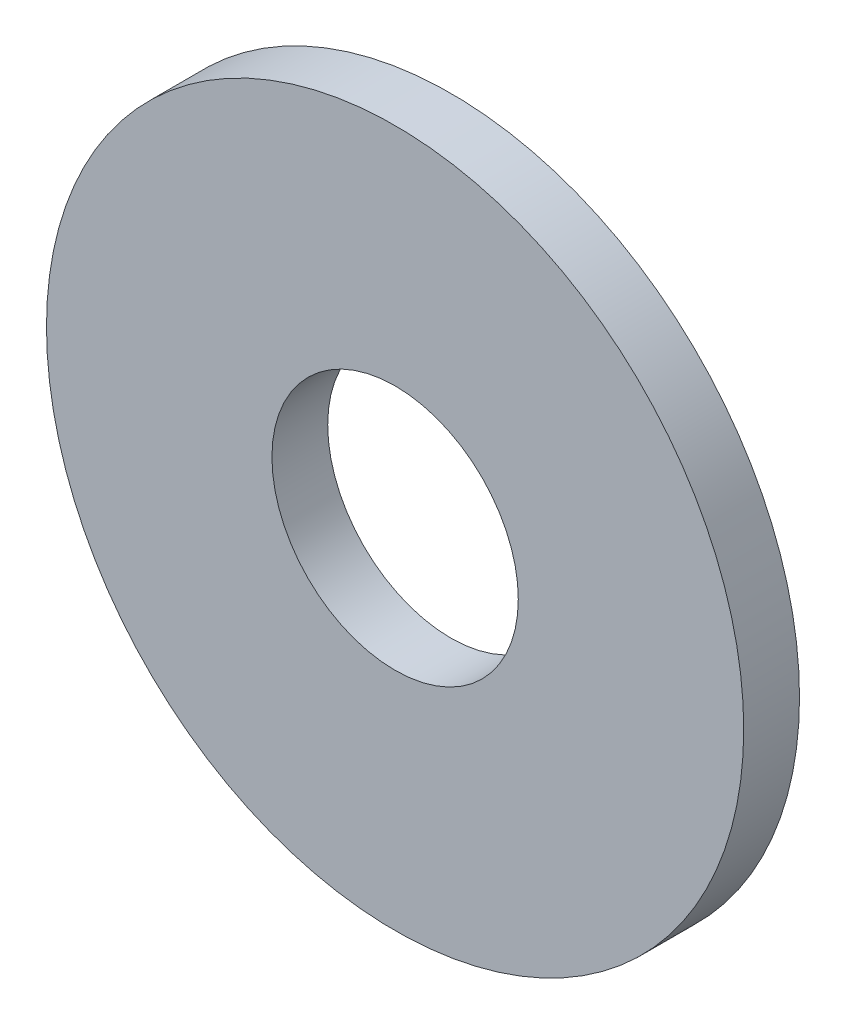
ISO-10303-21;
HEADER;
FILE_DESCRIPTION(('STEP AP214'),'2;1');
FILE_NAME('part.step','',(''),(''),'','','');
FILE_SCHEMA(('AUTOMOTIVE_DESIGN { 1 0 10303 214 1 1 1 1 }'));
ENDSEC;
DATA;
#1=APPLICATION_CONTEXT('core data for automotive mechanical design processes');
#2=APPLICATION_PROTOCOL_DEFINITION('international standard','automotive_design',2000,#1);
#3=PRODUCT_CONTEXT('',#1,'mechanical');
#4=PRODUCT('Part','Part','',(#3));
#5=PRODUCT_RELATED_PRODUCT_CATEGORY('part','',(#4));
#6=PRODUCT_DEFINITION_FORMATION('','',#4);
#7=PRODUCT_DEFINITION_CONTEXT('part definition',#1,'design');
#8=PRODUCT_DEFINITION('design','',#6,#7);
#9=PRODUCT_DEFINITION_SHAPE('','',#8);
#10=(LENGTH_UNIT() NAMED_UNIT(*) SI_UNIT(.MILLI.,.METRE.));
#11=(NAMED_UNIT(*) PLANE_ANGLE_UNIT() SI_UNIT($,.RADIAN.));
#12=(NAMED_UNIT(*) SI_UNIT($,.STERADIAN.) SOLID_ANGLE_UNIT());
#13=UNCERTAINTY_MEASURE_WITH_UNIT(LENGTH_MEASURE(1.E-05),#10,'distance_accuracy_value','');
#14=(GEOMETRIC_REPRESENTATION_CONTEXT(3) GLOBAL_UNCERTAINTY_ASSIGNED_CONTEXT((#13)) GLOBAL_UNIT_ASSIGNED_CONTEXT((#10,
#11,#12)) REPRESENTATION_CONTEXT('',''));
#15=CARTESIAN_POINT('',(0.,0.,0.));
#16=DIRECTION('',(0.,0.,1.));
#17=DIRECTION('',(1.,0.,0.));
#18=AXIS2_PLACEMENT_3D('',#15,#16,#17);
#19=CARTESIAN_POINT('',(0.,0.,5.));
#20=DIRECTION('',(0.,0.,1.));
#21=DIRECTION('',(1.,0.,0.));
#22=AXIS2_PLACEMENT_3D('',#19,#20,#21);
#23=CYLINDRICAL_SURFACE('',#22,2.65);
#24=CARTESIAN_POINT('',(0.,0.,-1.2));
#25=DIRECTION('',(0.,0.,1.));
#26=DIRECTION('',(1.,0.,0.));
#27=AXIS2_PLACEMENT_3D('',#24,#25,#26);
#28=CIRCLE('',#27,2.65);
#29=CARTESIAN_POINT('',(2.65,0.,-1.2));
#30=VERTEX_POINT('',#29);
#31=EDGE_CURVE('E10',#30,#30,#28,.T.);
#32=ORIENTED_EDGE('',*,*,#31,.F.);
#33=EDGE_LOOP('',(#32));
#34=FACE_BOUND('',#33,.T.);
#35=CARTESIAN_POINT('',(0.,0.,0.));
#36=DIRECTION('',(0.,0.,1.));
#37=DIRECTION('',(1.,0.,0.));
#38=AXIS2_PLACEMENT_3D('',#35,#36,#37);
#39=CIRCLE('',#38,2.65);
#40=CARTESIAN_POINT('',(2.65,0.,0.));
#41=VERTEX_POINT('',#40);
#42=EDGE_CURVE('E53',#41,#41,#39,.T.);
#43=ORIENTED_EDGE('',*,*,#42,.T.);
#44=EDGE_LOOP('',(#43));
#45=FACE_BOUND('',#44,.T.);
#46=ADVANCED_FACE('F39',(#34,#45),#23,.F.);
#47=CARTESIAN_POINT('',(0.,2.65,-1.2));
#48=DIRECTION('',(0.,0.,1.));
#49=DIRECTION('',(1.,0.,0.));
#50=AXIS2_PLACEMENT_3D('',#47,#48,#49);
#51=PLANE('',#50);
#52=CARTESIAN_POINT('',(0.,0.,-1.2));
#53=DIRECTION('',(0.,0.,1.));
#54=DIRECTION('',(1.,0.,0.));
#55=AXIS2_PLACEMENT_3D('',#52,#53,#54);
#56=CIRCLE('',#55,7.5);
#57=CARTESIAN_POINT('',(7.5,0.,-1.2));
#58=VERTEX_POINT('',#57);
#59=EDGE_CURVE('E45',#58,#58,#56,.T.);
#60=ORIENTED_EDGE('',*,*,#59,.F.);
#61=EDGE_LOOP('',(#60));
#62=FACE_BOUND('',#61,.T.);
#63=ORIENTED_EDGE('',*,*,#31,.T.);
#64=EDGE_LOOP('',(#63));
#65=FACE_BOUND('',#64,.T.);
#66=ADVANCED_FACE('F68',(#62,#65),#51,.F.);
#67=CARTESIAN_POINT('',(0.,0.,5.));
#68=DIRECTION('',(0.,0.,1.));
#69=DIRECTION('',(1.,0.,0.));
#70=AXIS2_PLACEMENT_3D('',#67,#68,#69);
#71=CYLINDRICAL_SURFACE('',#70,7.5);
#72=CARTESIAN_POINT('',(0.,0.,0.));
#73=DIRECTION('',(0.,0.,1.));
#74=DIRECTION('',(1.,0.,0.));
#75=AXIS2_PLACEMENT_3D('',#72,#73,#74);
#76=CIRCLE('',#75,7.5);
#77=CARTESIAN_POINT('',(7.5,0.,0.));
#78=VERTEX_POINT('',#77);
#79=EDGE_CURVE('E49',#78,#78,#76,.T.);
#80=ORIENTED_EDGE('',*,*,#79,.F.);
#81=EDGE_LOOP('',(#80));
#82=FACE_BOUND('',#81,.T.);
#83=ORIENTED_EDGE('',*,*,#59,.T.);
#84=EDGE_LOOP('',(#83));
#85=FACE_BOUND('',#84,.T.);
#86=ADVANCED_FACE('F63',(#82,#85),#71,.T.);
#87=CARTESIAN_POINT('',(0.,7.5,0.));
#88=DIRECTION('',(0.,0.,-1.));
#89=DIRECTION('',(-1.,0.,0.));
#90=AXIS2_PLACEMENT_3D('',#87,#88,#89);
#91=PLANE('',#90);
#92=ORIENTED_EDGE('',*,*,#42,.F.);
#93=EDGE_LOOP('',(#92));
#94=FACE_BOUND('',#93,.T.);
#95=ORIENTED_EDGE('',*,*,#79,.T.);
#96=EDGE_LOOP('',(#95));
#97=FACE_BOUND('',#96,.T.);
#98=ADVANCED_FACE('F60',(#94,#97),#91,.F.);
#99=CLOSED_SHELL('',(#46,#66,#86,#98));
#100=MANIFOLD_SOLID_BREP('B2',#99);
#101=ADVANCED_BREP_SHAPE_REPRESENTATION('',(#18,#100),#14);
#102=SHAPE_DEFINITION_REPRESENTATION(#9,#101);
ENDSEC;
END-ISO-10303-21;
